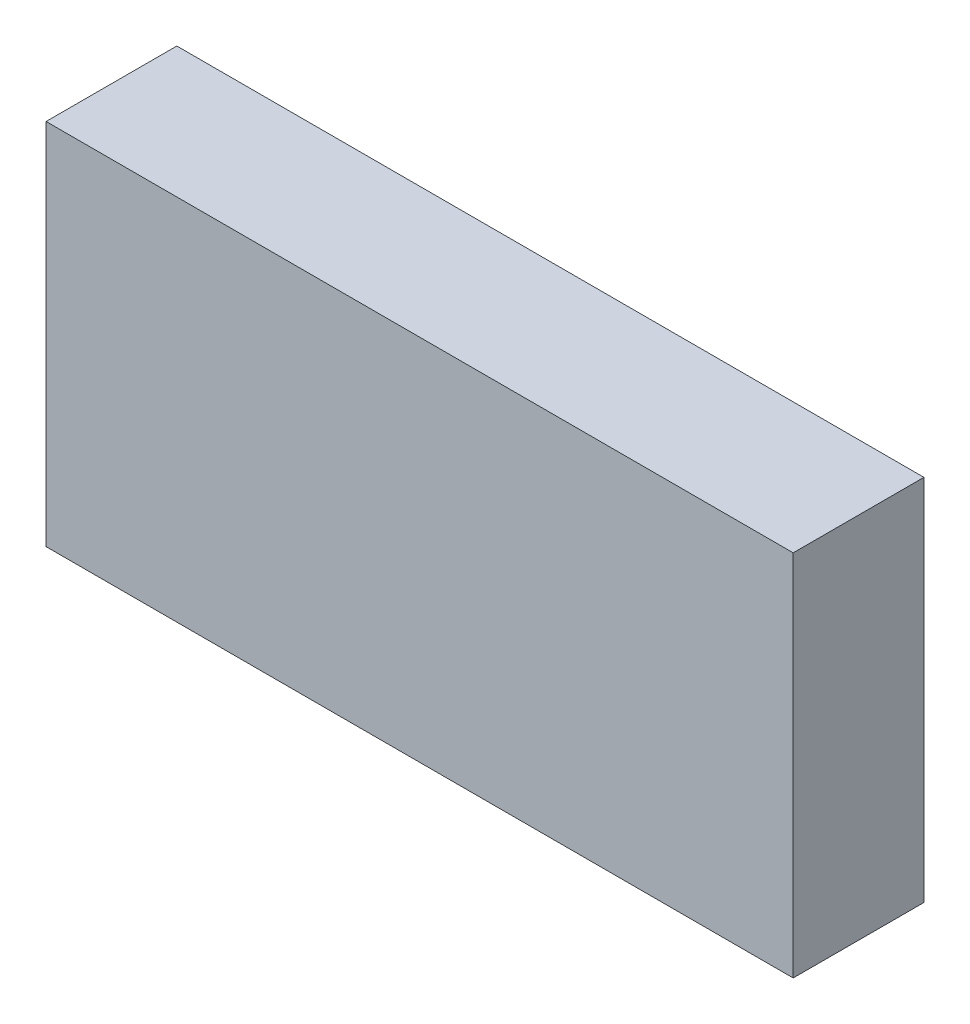
ISO-10303-21;
HEADER;
FILE_DESCRIPTION(('STEP AP214'),'2;1');
FILE_NAME('part.step','',(''),(''),'','','');
FILE_SCHEMA(('AUTOMOTIVE_DESIGN { 1 0 10303 214 1 1 1 1 }'));
ENDSEC;
DATA;
#1=APPLICATION_CONTEXT('core data for automotive mechanical design processes');
#2=APPLICATION_PROTOCOL_DEFINITION('international standard','automotive_design',2000,#1);
#3=PRODUCT_CONTEXT('',#1,'mechanical');
#4=PRODUCT('Part','Part','',(#3));
#5=PRODUCT_RELATED_PRODUCT_CATEGORY('part','',(#4));
#6=PRODUCT_DEFINITION_FORMATION('','',#4);
#7=PRODUCT_DEFINITION_CONTEXT('part definition',#1,'design');
#8=PRODUCT_DEFINITION('design','',#6,#7);
#9=PRODUCT_DEFINITION_SHAPE('','',#8);
#10=(LENGTH_UNIT() NAMED_UNIT(*) SI_UNIT(.MILLI.,.METRE.));
#11=(NAMED_UNIT(*) PLANE_ANGLE_UNIT() SI_UNIT($,.RADIAN.));
#12=(NAMED_UNIT(*) SI_UNIT($,.STERADIAN.) SOLID_ANGLE_UNIT());
#13=UNCERTAINTY_MEASURE_WITH_UNIT(LENGTH_MEASURE(1.E-05),#10,'distance_accuracy_value','');
#14=(GEOMETRIC_REPRESENTATION_CONTEXT(3) GLOBAL_UNCERTAINTY_ASSIGNED_CONTEXT((#13)) GLOBAL_UNIT_ASSIGNED_CONTEXT((#10,
#11,#12)) REPRESENTATION_CONTEXT('',''));
#15=CARTESIAN_POINT('',(0.,0.,0.));
#16=DIRECTION('',(0.,0.,1.));
#17=DIRECTION('',(1.,0.,0.));
#18=AXIS2_PLACEMENT_3D('',#15,#16,#17);
#19=CARTESIAN_POINT('',(1.6002,-0.78867,0.55999888));
#20=DIRECTION('',(0.,0.,1.));
#21=DIRECTION('',(1.,0.,0.));
#22=AXIS2_PLACEMENT_3D('',#19,#20,#21);
#23=PLANE('',#22);
#24=DIRECTION('',(0.,1.,0.));
#25=VECTOR('',#24,1.);
#26=CARTESIAN_POINT('',(-1.6002,-0.78867,0.55999888));
#27=LINE('',#26,#25);
#28=CARTESIAN_POINT('',(-1.6002,-0.78867,0.55999888));
#29=VERTEX_POINT('',#28);
#30=CARTESIAN_POINT('',(-1.6002,0.78867,0.55999888));
#31=VERTEX_POINT('',#30);
#32=EDGE_CURVE('E53',#29,#31,#27,.T.);
#33=ORIENTED_EDGE('',*,*,#32,.F.);
#34=DIRECTION('',(1.,0.,0.));
#35=VECTOR('',#34,1.);
#36=CARTESIAN_POINT('',(1.6002,-0.78867,0.55999888));
#37=LINE('',#36,#35);
#38=CARTESIAN_POINT('',(1.6002,-0.78867,0.55999888));
#39=VERTEX_POINT('',#38);
#40=EDGE_CURVE('E68',#39,#29,#37,.F.);
#41=ORIENTED_EDGE('',*,*,#40,.F.);
#42=DIRECTION('',(0.,1.,0.));
#43=VECTOR('',#42,1.);
#44=CARTESIAN_POINT('',(1.6002,0.78867,0.55999888));
#45=LINE('',#44,#43);
#46=CARTESIAN_POINT('',(1.6002,0.78867,0.55999888));
#47=VERTEX_POINT('',#46);
#48=EDGE_CURVE('E20',#47,#39,#45,.F.);
#49=ORIENTED_EDGE('',*,*,#48,.F.);
#50=DIRECTION('',(1.,0.,0.));
#51=VECTOR('',#50,1.);
#52=CARTESIAN_POINT('',(-1.6002,0.78867,0.55999888));
#53=LINE('',#52,#51);
#54=EDGE_CURVE('E58',#31,#47,#53,.T.);
#55=ORIENTED_EDGE('',*,*,#54,.F.);
#56=EDGE_LOOP('',(#33,#41,#49,#55));
#57=FACE_BOUND('',#56,.T.);
#58=ADVANCED_FACE('F17',(#57),#23,.T.);
#59=CARTESIAN_POINT('',(1.6002,0.78867,0.));
#60=DIRECTION('',(1.,0.,0.));
#61=DIRECTION('',(0.,0.,-1.));
#62=AXIS2_PLACEMENT_3D('',#59,#60,#61);
#63=PLANE('',#62);
#64=DIRECTION('',(0.,0.,-1.));
#65=VECTOR('',#64,1.);
#66=CARTESIAN_POINT('',(1.6002,-0.78867,0.));
#67=LINE('',#66,#65);
#68=CARTESIAN_POINT('',(1.6002,-0.78867,0.));
#69=VERTEX_POINT('',#68);
#70=EDGE_CURVE('E79',#69,#39,#67,.F.);
#71=ORIENTED_EDGE('',*,*,#70,.F.);
#72=DIRECTION('',(0.,1.,0.));
#73=VECTOR('',#72,1.);
#74=CARTESIAN_POINT('',(1.6002,-0.78867,0.));
#75=LINE('',#74,#73);
#76=CARTESIAN_POINT('',(1.6002,0.78867,0.));
#77=VERTEX_POINT('',#76);
#78=EDGE_CURVE('E74',#69,#77,#75,.T.);
#79=ORIENTED_EDGE('',*,*,#78,.T.);
#80=DIRECTION('',(0.,0.,1.));
#81=VECTOR('',#80,1.);
#82=CARTESIAN_POINT('',(1.6002,0.78867,0.));
#83=LINE('',#82,#81);
#84=EDGE_CURVE('E63',#47,#77,#83,.F.);
#85=ORIENTED_EDGE('',*,*,#84,.F.);
#86=ORIENTED_EDGE('',*,*,#48,.T.);
#87=EDGE_LOOP('',(#71,#79,#85,#86));
#88=FACE_BOUND('',#87,.T.);
#89=ADVANCED_FACE('F73',(#88),#63,.T.);
#90=CARTESIAN_POINT('',(-1.6002,0.78867,0.));
#91=DIRECTION('',(0.,1.,0.));
#92=DIRECTION('',(0.,0.,1.));
#93=AXIS2_PLACEMENT_3D('',#90,#91,#92);
#94=PLANE('',#93);
#95=ORIENTED_EDGE('',*,*,#84,.T.);
#96=DIRECTION('',(1.,0.,0.));
#97=VECTOR('',#96,1.);
#98=CARTESIAN_POINT('',(1.6002,0.78867,0.));
#99=LINE('',#98,#97);
#100=CARTESIAN_POINT('',(-1.6002,0.78867,0.));
#101=VERTEX_POINT('',#100);
#102=EDGE_CURVE('E84',#77,#101,#99,.F.);
#103=ORIENTED_EDGE('',*,*,#102,.T.);
#104=DIRECTION('',(0.,0.,1.));
#105=VECTOR('',#104,1.);
#106=CARTESIAN_POINT('',(-1.6002,0.78867,0.));
#107=LINE('',#106,#105);
#108=EDGE_CURVE('E65',#31,#101,#107,.F.);
#109=ORIENTED_EDGE('',*,*,#108,.F.);
#110=ORIENTED_EDGE('',*,*,#54,.T.);
#111=EDGE_LOOP('',(#95,#103,#109,#110));
#112=FACE_BOUND('',#111,.T.);
#113=ADVANCED_FACE('F60',(#112),#94,.T.);
#114=CARTESIAN_POINT('',(-1.6002,-0.78867,0.));
#115=DIRECTION('',(-1.,0.,0.));
#116=DIRECTION('',(0.,0.,1.));
#117=AXIS2_PLACEMENT_3D('',#114,#115,#116);
#118=PLANE('',#117);
#119=ORIENTED_EDGE('',*,*,#108,.T.);
#120=DIRECTION('',(0.,1.,0.));
#121=VECTOR('',#120,1.);
#122=CARTESIAN_POINT('',(-1.6002,-0.78867,0.));
#123=LINE('',#122,#121);
#124=CARTESIAN_POINT('',(-1.6002,-0.78867,0.));
#125=VERTEX_POINT('',#124);
#126=EDGE_CURVE('E26',#101,#125,#123,.F.);
#127=ORIENTED_EDGE('',*,*,#126,.T.);
#128=DIRECTION('',(0.,0.,-1.));
#129=VECTOR('',#128,1.);
#130=CARTESIAN_POINT('',(-1.6002,-0.78867,0.));
#131=LINE('',#130,#129);
#132=EDGE_CURVE('E34',#29,#125,#131,.T.);
#133=ORIENTED_EDGE('',*,*,#132,.F.);
#134=ORIENTED_EDGE('',*,*,#32,.T.);
#135=EDGE_LOOP('',(#119,#127,#133,#134));
#136=FACE_BOUND('',#135,.T.);
#137=ADVANCED_FACE('F88',(#136),#118,.T.);
#138=CARTESIAN_POINT('',(1.6002,-0.78867,0.));
#139=DIRECTION('',(0.,-1.,0.));
#140=DIRECTION('',(0.,0.,-1.));
#141=AXIS2_PLACEMENT_3D('',#138,#139,#140);
#142=PLANE('',#141);
#143=ORIENTED_EDGE('',*,*,#132,.T.);
#144=DIRECTION('',(1.,0.,0.));
#145=VECTOR('',#144,1.);
#146=CARTESIAN_POINT('',(1.6002,-0.78867,0.));
#147=LINE('',#146,#145);
#148=EDGE_CURVE('E11',#125,#69,#147,.T.);
#149=ORIENTED_EDGE('',*,*,#148,.T.);
#150=ORIENTED_EDGE('',*,*,#70,.T.);
#151=ORIENTED_EDGE('',*,*,#40,.T.);
#152=EDGE_LOOP('',(#143,#149,#150,#151));
#153=FACE_BOUND('',#152,.T.);
#154=ADVANCED_FACE('F91',(#153),#142,.T.);
#155=CARTESIAN_POINT('',(1.6002,-0.78867,0.));
#156=DIRECTION('',(0.,0.,1.));
#157=DIRECTION('',(1.,0.,0.));
#158=AXIS2_PLACEMENT_3D('',#155,#156,#157);
#159=PLANE('',#158);
#160=ORIENTED_EDGE('',*,*,#126,.F.);
#161=ORIENTED_EDGE('',*,*,#102,.F.);
#162=ORIENTED_EDGE('',*,*,#78,.F.);
#163=ORIENTED_EDGE('',*,*,#148,.F.);
#164=EDGE_LOOP('',(#160,#161,#162,#163));
#165=FACE_BOUND('',#164,.T.);
#166=ADVANCED_FACE('F90',(#165),#159,.F.);
#167=CLOSED_SHELL('',(#58,#89,#113,#137,#154,#166));
#168=MANIFOLD_SOLID_BREP('B1',#167);
#169=ADVANCED_BREP_SHAPE_REPRESENTATION('',(#18,#168),#14);
#170=SHAPE_DEFINITION_REPRESENTATION(#9,#169);
ENDSEC;
END-ISO-10303-21;
